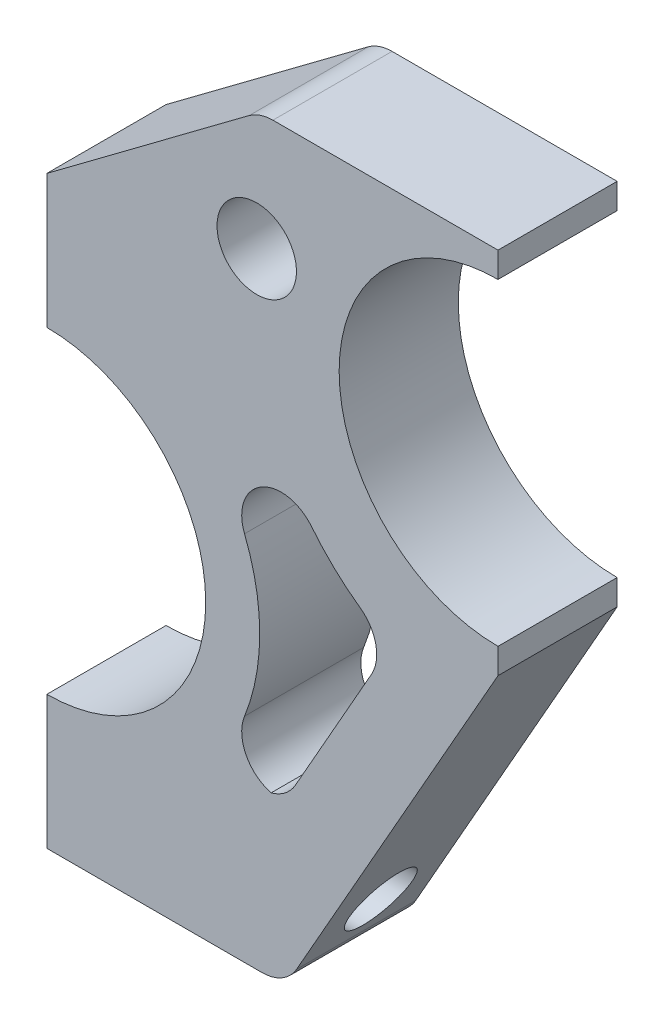
ISO-10303-21;
HEADER;
FILE_DESCRIPTION(('STEP AP214'),'2;1');
FILE_NAME('part.step','',(''),(''),'','','');
FILE_SCHEMA(('AUTOMOTIVE_DESIGN { 1 0 10303 214 1 1 1 1 }'));
ENDSEC;
DATA;
#1=APPLICATION_CONTEXT('core data for automotive mechanical design processes');
#2=APPLICATION_PROTOCOL_DEFINITION('international standard','automotive_design',2000,#1);
#3=PRODUCT_CONTEXT('',#1,'mechanical');
#4=PRODUCT('Part','Part','',(#3));
#5=PRODUCT_RELATED_PRODUCT_CATEGORY('part','',(#4));
#6=PRODUCT_DEFINITION_FORMATION('','',#4);
#7=PRODUCT_DEFINITION_CONTEXT('part definition',#1,'design');
#8=PRODUCT_DEFINITION('design','',#6,#7);
#9=PRODUCT_DEFINITION_SHAPE('','',#8);
#10=(LENGTH_UNIT() NAMED_UNIT(*) SI_UNIT(.MILLI.,.METRE.));
#11=(NAMED_UNIT(*) PLANE_ANGLE_UNIT() SI_UNIT($,.RADIAN.));
#12=(NAMED_UNIT(*) SI_UNIT($,.STERADIAN.) SOLID_ANGLE_UNIT());
#13=UNCERTAINTY_MEASURE_WITH_UNIT(LENGTH_MEASURE(1.E-05),#10,'distance_accuracy_value','');
#14=(GEOMETRIC_REPRESENTATION_CONTEXT(3) GLOBAL_UNCERTAINTY_ASSIGNED_CONTEXT((#13)) GLOBAL_UNIT_ASSIGNED_CONTEXT((#10,
#11,#12)) REPRESENTATION_CONTEXT('',''));
#15=CARTESIAN_POINT('',(0.,0.,0.));
#16=DIRECTION('',(0.,0.,1.));
#17=DIRECTION('',(1.,0.,0.));
#18=AXIS2_PLACEMENT_3D('',#15,#16,#17);
#19=CARTESIAN_POINT('',(-169.887417499531,827.319119624844,9.525));
#20=DIRECTION('',(0.,0.,1.));
#21=DIRECTION('',(1.,0.,0.));
#22=AXIS2_PLACEMENT_3D('',#19,#20,#21);
#23=PLANE('',#22);
#24=CARTESIAN_POINT('',(-169.887417499531,827.319119624844,9.525));
#25=DIRECTION('',(0.,0.,-1.));
#26=DIRECTION('',(-1.,0.,0.));
#27=AXIS2_PLACEMENT_3D('',#24,#25,#26);
#28=CIRCLE('',#27,12.7);
#29=CARTESIAN_POINT('',(-169.887417499531,840.019119624844,9.525));
#30=VERTEX_POINT('',#29);
#31=CARTESIAN_POINT('',(-169.887417499531,814.619119624844,9.525));
#32=VERTEX_POINT('',#31);
#33=EDGE_CURVE('E59',#30,#32,#28,.T.);
#34=ORIENTED_EDGE('',*,*,#33,.T.);
#35=DIRECTION('',(0.,-1.,0.));
#36=VECTOR('',#35,1.);
#37=CARTESIAN_POINT('',(-169.887417499531,816.651119624844,9.525));
#38=LINE('',#37,#36);
#39=CARTESIAN_POINT('',(-169.887417499531,803.951119624844,9.525));
#40=VERTEX_POINT('',#39);
#41=EDGE_CURVE('E202',#32,#40,#38,.T.);
#42=ORIENTED_EDGE('',*,*,#41,.T.);
#43=DIRECTION('',(1.,0.,0.));
#44=VECTOR('',#43,1.);
#45=CARTESIAN_POINT('',(-169.887417499531,803.951119624844,9.525));
#46=LINE('',#45,#44);
#47=CARTESIAN_POINT('',(-152.686373541407,803.951119624844,9.525));
#48=VERTEX_POINT('',#47);
#49=EDGE_CURVE('E207',#40,#48,#46,.T.);
#50=ORIENTED_EDGE('',*,*,#49,.T.);
#51=CARTESIAN_POINT('',(-152.686373541407,807.126119624844,9.525));
#52=DIRECTION('',(0.,0.,1.));
#53=DIRECTION('',(1.,0.,0.));
#54=AXIS2_PLACEMENT_3D('',#51,#52,#53);
#55=CIRCLE('',#54,3.175);
#56=CARTESIAN_POINT('',(-149.924943989956,805.559233594409,9.525));
#57=VERTEX_POINT('',#56);
#58=EDGE_CURVE('E264',#48,#57,#55,.T.);
#59=ORIENTED_EDGE('',*,*,#58,.T.);
#60=DIRECTION('',(0.493507411160631,0.869741591008233,0.));
#61=VECTOR('',#60,1.);
#62=CARTESIAN_POINT('',(-150.837417499531,803.951119624844,9.525));
#63=LINE('',#62,#61);
#64=CARTESIAN_POINT('',(-133.819417499531,833.943095552761,9.525));
#65=VERTEX_POINT('',#64);
#66=EDGE_CURVE('E378',#57,#65,#63,.T.);
#67=ORIENTED_EDGE('',*,*,#66,.T.);
#68=DIRECTION('',(0.,1.,0.));
#69=VECTOR('',#68,1.);
#70=CARTESIAN_POINT('',(-133.819417499531,833.943095552761,9.525));
#71=LINE('',#70,#69);
#72=CARTESIAN_POINT('',(-133.819417499531,835.975095552761,9.525));
#73=VERTEX_POINT('',#72);
#74=EDGE_CURVE('E381',#65,#73,#71,.T.);
#75=ORIENTED_EDGE('',*,*,#74,.T.);
#76=CARTESIAN_POINT('',(-133.819417499531,848.675095552761,9.525));
#77=DIRECTION('',(0.,0.,-1.));
#78=DIRECTION('',(1.,0.,0.));
#79=AXIS2_PLACEMENT_3D('',#76,#77,#78);
#80=CIRCLE('',#79,12.7);
#81=CARTESIAN_POINT('',(-133.819417499531,861.375095552761,9.525));
#82=VERTEX_POINT('',#81);
#83=EDGE_CURVE('E384',#73,#82,#80,.T.);
#84=ORIENTED_EDGE('',*,*,#83,.T.);
#85=DIRECTION('',(0.,1.,0.));
#86=VECTOR('',#85,1.);
#87=CARTESIAN_POINT('',(-133.819417499531,861.375095552761,9.525));
#88=LINE('',#87,#86);
#89=CARTESIAN_POINT('',(-133.819417499531,863.407095552761,9.525));
#90=VERTEX_POINT('',#89);
#91=EDGE_CURVE('E387',#82,#90,#88,.T.);
#92=ORIENTED_EDGE('',*,*,#91,.T.);
#93=DIRECTION('',(-1.,0.,0.));
#94=VECTOR('',#93,1.);
#95=CARTESIAN_POINT('',(-133.819417499531,863.407095552761,9.525));
#96=LINE('',#95,#94);
#97=CARTESIAN_POINT('',(-151.813974092557,863.407095552761,9.525));
#98=VERTEX_POINT('',#97);
#99=EDGE_CURVE('E390',#90,#98,#96,.T.);
#100=ORIENTED_EDGE('',*,*,#99,.T.);
#101=CARTESIAN_POINT('',(-151.813974092557,860.232095552761,9.525));
#102=DIRECTION('',(0.,0.,1.));
#103=DIRECTION('',(1.,0.,0.));
#104=AXIS2_PLACEMENT_3D('',#101,#102,#103);
#105=CIRCLE('',#104,3.175);
#106=CARTESIAN_POINT('',(-153.71480890654,862.775214112708,9.525));
#107=VERTEX_POINT('',#106);
#108=EDGE_CURVE('E267',#98,#107,#105,.T.);
#109=ORIENTED_EDGE('',*,*,#108,.T.);
#110=DIRECTION('',(-0.80098222360548,-0.598688130388453,0.));
#111=VECTOR('',#110,1.);
#112=CARTESIAN_POINT('',(-152.869417499531,863.407095552761,9.525));
#113=LINE('',#112,#111);
#114=CARTESIAN_POINT('',(-169.887417499531,850.687119624844,9.525));
#115=VERTEX_POINT('',#114);
#116=EDGE_CURVE('E394',#107,#115,#113,.T.);
#117=ORIENTED_EDGE('',*,*,#116,.T.);
#118=DIRECTION('',(0.,-1.,0.));
#119=VECTOR('',#118,1.);
#120=CARTESIAN_POINT('',(-169.887417499531,850.687119624844,9.525));
#121=LINE('',#120,#119);
#122=EDGE_CURVE('E216',#115,#30,#121,.T.);
#123=ORIENTED_EDGE('',*,*,#122,.T.);
#124=EDGE_LOOP('',(#34,#42,#50,#59,#67,#75,#84,#92,#100,#109,#117,#123));
#125=FACE_BOUND('',#124,.T.);
#126=CARTESIAN_POINT('',(-153.108454604195,853.862119624844,9.525));
#127=DIRECTION('',(0.,0.,1.));
#128=DIRECTION('',(1.,0.,0.));
#129=AXIS2_PLACEMENT_3D('',#126,#127,#128);
#130=CIRCLE('',#129,3.175);
#131=CARTESIAN_POINT('',(-156.283454604195,853.862119624844,9.525));
#132=VERTEX_POINT('',#131);
#133=EDGE_CURVE('E368',#132,#132,#130,.T.);
#134=ORIENTED_EDGE('',*,*,#133,.F.);
#135=EDGE_LOOP('',(#134));
#136=FACE_BOUND('',#135,.T.);
#137=CARTESIAN_POINT('',(-152.781178572134,819.826119624844,9.525));
#138=DIRECTION('',(0.,0.,1.));
#139=DIRECTION('',(1.,0.,0.));
#140=AXIS2_PLACEMENT_3D('',#137,#138,#139);
#141=CIRCLE('',#140,3.175);
#142=CARTESIAN_POINT('',(-150.019749020682,818.259233594409,9.525));
#143=VERTEX_POINT('',#142);
#144=CARTESIAN_POINT('',(-151.958635392584,816.759517642556,9.525));
#145=VERTEX_POINT('',#144);
#146=EDGE_CURVE('E292',#143,#145,#141,.F.);
#147=ORIENTED_EDGE('',*,*,#146,.T.);
#148=CARTESIAN_POINT('',(-151.136092213035,819.826119624844,9.525));
#149=DIRECTION('',(0.,0.,1.));
#150=DIRECTION('',(1.,0.,0.));
#151=AXIS2_PLACEMENT_3D('',#148,#149,#150);
#152=CIRCLE('',#151,3.175);
#153=CARTESIAN_POINT('',(-154.084413798962,821.004264278933,9.525));
#154=VERTEX_POINT('',#153);
#155=EDGE_CURVE('E52',#145,#154,#152,.F.);
#156=ORIENTED_EDGE('',*,*,#155,.T.);
#157=CARTESIAN_POINT('',(-169.887417499531,827.319119624844,9.525));
#158=DIRECTION('',(0.,0.,-1.));
#159=DIRECTION('',(1.,0.,0.));
#160=AXIS2_PLACEMENT_3D('',#157,#158,#159);
#161=CIRCLE('',#160,17.018);
#162=CARTESIAN_POINT('',(-154.084413798962,833.633974970756,9.525));
#163=VERTEX_POINT('',#162);
#164=EDGE_CURVE('E344',#163,#154,#161,.T.);
#165=ORIENTED_EDGE('',*,*,#164,.F.);
#166=CARTESIAN_POINT('',(-151.136092213035,834.812119624844,9.525));
#167=DIRECTION('',(0.,0.,1.));
#168=DIRECTION('',(1.,0.,0.));
#169=AXIS2_PLACEMENT_3D('',#166,#167,#168);
#170=CIRCLE('',#169,3.175);
#171=CARTESIAN_POINT('',(-151.163497821367,837.987001344315,9.525));
#172=VERTEX_POINT('',#171);
#173=EDGE_CURVE('E66',#163,#172,#170,.F.);
#174=ORIENTED_EDGE('',*,*,#173,.T.);
#175=CARTESIAN_POINT('',(-151.190903429699,834.812119624844,9.525));
#176=DIRECTION('',(0.,0.,1.));
#177=DIRECTION('',(1.,0.,0.));
#178=AXIS2_PLACEMENT_3D('',#175,#176,#177);
#179=CIRCLE('',#178,3.175);
#180=CARTESIAN_POINT('',(-148.709262582532,836.792544757404,9.525));
#181=VERTEX_POINT('',#180);
#182=EDGE_CURVE('E298',#172,#181,#179,.F.);
#183=ORIENTED_EDGE('',*,*,#182,.T.);
#184=CARTESIAN_POINT('',(-133.819417499531,848.675095552761,9.525));
#185=DIRECTION('',(0.,0.,-1.));
#186=DIRECTION('',(1.,0.,0.));
#187=AXIS2_PLACEMENT_3D('',#184,#185,#186);
#188=CIRCLE('',#187,19.05);
#189=CARTESIAN_POINT('',(-144.853056684026,833.14572639795,9.525));
#190=VERTEX_POINT('',#189);
#191=EDGE_CURVE('E353',#190,#181,#188,.T.);
#192=ORIENTED_EDGE('',*,*,#191,.F.);
#193=CARTESIAN_POINT('',(-146.691996548108,830.557498205482,9.525));
#194=DIRECTION('',(0.,0.,1.));
#195=DIRECTION('',(1.,0.,0.));
#196=AXIS2_PLACEMENT_3D('',#193,#194,#195);
#197=CIRCLE('',#196,3.175);
#198=CARTESIAN_POINT('',(-143.930566996657,828.990612175047,9.525));
#199=VERTEX_POINT('',#198);
#200=EDGE_CURVE('E286',#190,#199,#197,.F.);
#201=ORIENTED_EDGE('',*,*,#200,.T.);
#202=DIRECTION('',(0.493507411160631,0.869741591008233,0.));
#203=VECTOR('',#202,1.);
#204=CARTESIAN_POINT('',(-150.932222530258,816.651119624844,9.525));
#205=LINE('',#204,#203);
#206=EDGE_CURVE('E348',#143,#199,#205,.T.);
#207=ORIENTED_EDGE('',*,*,#206,.F.);
#208=EDGE_LOOP('',(#147,#156,#165,#174,#183,#192,#201,#207));
#209=FACE_BOUND('',#208,.T.);
#210=ADVANCED_FACE('F43',(#125,#136,#209),#23,.T.);
#211=CARTESIAN_POINT('',(-169.887417499531,827.319119624844,0.));
#212=DIRECTION('',(0.,0.,1.));
#213=DIRECTION('',(1.,0.,0.));
#214=AXIS2_PLACEMENT_3D('',#211,#212,#213);
#215=PLANE('',#214);
#216=CARTESIAN_POINT('',(-153.108454604195,853.862119624844,0.));
#217=DIRECTION('',(0.,0.,1.));
#218=DIRECTION('',(1.,0.,0.));
#219=AXIS2_PLACEMENT_3D('',#216,#217,#218);
#220=CIRCLE('',#219,3.175);
#221=CARTESIAN_POINT('',(-156.283454604195,853.862119624844,0.));
#222=VERTEX_POINT('',#221);
#223=EDGE_CURVE('E357',#222,#222,#220,.T.);
#224=ORIENTED_EDGE('',*,*,#223,.T.);
#225=EDGE_LOOP('',(#224));
#226=FACE_BOUND('',#225,.T.);
#227=DIRECTION('',(0.,-1.,0.));
#228=VECTOR('',#227,1.);
#229=CARTESIAN_POINT('',(-169.887417499531,816.651119624844,0.));
#230=LINE('',#229,#228);
#231=CARTESIAN_POINT('',(-169.887417499531,814.619119624844,0.));
#232=VERTEX_POINT('',#231);
#233=CARTESIAN_POINT('',(-169.887417499531,803.951119624844,0.));
#234=VERTEX_POINT('',#233);
#235=EDGE_CURVE('E194',#232,#234,#230,.T.);
#236=ORIENTED_EDGE('',*,*,#235,.F.);
#237=CARTESIAN_POINT('',(-169.887417499531,827.319119624844,0.));
#238=DIRECTION('',(0.,0.,-1.));
#239=DIRECTION('',(-1.,0.,0.));
#240=AXIS2_PLACEMENT_3D('',#237,#238,#239);
#241=CIRCLE('',#240,12.7);
#242=CARTESIAN_POINT('',(-169.887417499531,840.019119624844,0.));
#243=VERTEX_POINT('',#242);
#244=EDGE_CURVE('E180',#243,#232,#241,.T.);
#245=ORIENTED_EDGE('',*,*,#244,.F.);
#246=DIRECTION('',(0.,-1.,0.));
#247=VECTOR('',#246,1.);
#248=CARTESIAN_POINT('',(-169.887417499531,850.687119624844,0.));
#249=LINE('',#248,#247);
#250=CARTESIAN_POINT('',(-169.887417499531,850.687119624844,0.));
#251=VERTEX_POINT('',#250);
#252=EDGE_CURVE('E192',#251,#243,#249,.T.);
#253=ORIENTED_EDGE('',*,*,#252,.F.);
#254=DIRECTION('',(-0.80098222360548,-0.598688130388453,0.));
#255=VECTOR('',#254,1.);
#256=CARTESIAN_POINT('',(-152.869417499531,863.407095552761,0.));
#257=LINE('',#256,#255);
#258=CARTESIAN_POINT('',(-153.71480890654,862.775214112708,0.));
#259=VERTEX_POINT('',#258);
#260=EDGE_CURVE('E203',#259,#251,#257,.T.);
#261=ORIENTED_EDGE('',*,*,#260,.F.);
#262=CARTESIAN_POINT('',(-151.813974092557,860.232095552761,0.));
#263=DIRECTION('',(0.,0.,1.));
#264=DIRECTION('',(1.,0.,0.));
#265=AXIS2_PLACEMENT_3D('',#262,#263,#264);
#266=CIRCLE('',#265,3.175);
#267=CARTESIAN_POINT('',(-151.813974092557,863.407095552761,0.));
#268=VERTEX_POINT('',#267);
#269=EDGE_CURVE('E258',#259,#268,#266,.F.);
#270=ORIENTED_EDGE('',*,*,#269,.T.);
#271=DIRECTION('',(-1.,0.,0.));
#272=VECTOR('',#271,1.);
#273=CARTESIAN_POINT('',(-133.819417499531,863.407095552761,0.));
#274=LINE('',#273,#272);
#275=CARTESIAN_POINT('',(-133.819417499531,863.407095552761,0.));
#276=VERTEX_POINT('',#275);
#277=EDGE_CURVE('E209',#276,#268,#274,.T.);
#278=ORIENTED_EDGE('',*,*,#277,.F.);
#279=DIRECTION('',(0.,1.,0.));
#280=VECTOR('',#279,1.);
#281=CARTESIAN_POINT('',(-133.819417499531,861.375095552761,0.));
#282=LINE('',#281,#280);
#283=CARTESIAN_POINT('',(-133.819417499531,861.375095552761,0.));
#284=VERTEX_POINT('',#283);
#285=EDGE_CURVE('E414',#284,#276,#282,.T.);
#286=ORIENTED_EDGE('',*,*,#285,.F.);
#287=CARTESIAN_POINT('',(-133.819417499531,848.675095552761,0.));
#288=DIRECTION('',(0.,0.,-1.));
#289=DIRECTION('',(1.,0.,0.));
#290=AXIS2_PLACEMENT_3D('',#287,#288,#289);
#291=CIRCLE('',#290,12.7);
#292=CARTESIAN_POINT('',(-133.819417499531,835.975095552761,0.));
#293=VERTEX_POINT('',#292);
#294=EDGE_CURVE('E411',#293,#284,#291,.T.);
#295=ORIENTED_EDGE('',*,*,#294,.F.);
#296=DIRECTION('',(0.,1.,0.));
#297=VECTOR('',#296,1.);
#298=CARTESIAN_POINT('',(-133.819417499531,833.943095552761,0.));
#299=LINE('',#298,#297);
#300=CARTESIAN_POINT('',(-133.819417499531,833.943095552761,0.));
#301=VERTEX_POINT('',#300);
#302=EDGE_CURVE('E408',#301,#293,#299,.T.);
#303=ORIENTED_EDGE('',*,*,#302,.F.);
#304=DIRECTION('',(0.493507411160631,0.869741591008233,0.));
#305=VECTOR('',#304,1.);
#306=CARTESIAN_POINT('',(-150.837417499531,803.951119624844,0.));
#307=LINE('',#306,#305);
#308=CARTESIAN_POINT('',(-149.924943989956,805.559233594409,0.));
#309=VERTEX_POINT('',#308);
#310=EDGE_CURVE('E405',#309,#301,#307,.T.);
#311=ORIENTED_EDGE('',*,*,#310,.F.);
#312=CARTESIAN_POINT('',(-152.686373541407,807.126119624844,0.));
#313=DIRECTION('',(0.,0.,1.));
#314=DIRECTION('',(1.,0.,0.));
#315=AXIS2_PLACEMENT_3D('',#312,#313,#314);
#316=CIRCLE('',#315,3.175);
#317=CARTESIAN_POINT('',(-152.686373541407,803.951119624844,0.));
#318=VERTEX_POINT('',#317);
#319=EDGE_CURVE('E255',#309,#318,#316,.F.);
#320=ORIENTED_EDGE('',*,*,#319,.T.);
#321=DIRECTION('',(1.,0.,0.));
#322=VECTOR('',#321,1.);
#323=CARTESIAN_POINT('',(-169.887417499531,803.951119624844,0.));
#324=LINE('',#323,#322);
#325=EDGE_CURVE('E401',#234,#318,#324,.T.);
#326=ORIENTED_EDGE('',*,*,#325,.F.);
#327=EDGE_LOOP('',(#236,#245,#253,#261,#270,#278,#286,#295,#303,#311,#320,#326));
#328=FACE_BOUND('',#327,.T.);
#329=CARTESIAN_POINT('',(-151.190903429699,834.812119624844,0.));
#330=DIRECTION('',(0.,0.,1.));
#331=DIRECTION('',(1.,0.,0.));
#332=AXIS2_PLACEMENT_3D('',#329,#330,#331);
#333=CIRCLE('',#332,3.175);
#334=CARTESIAN_POINT('',(-148.709262582532,836.792544757404,0.));
#335=VERTEX_POINT('',#334);
#336=CARTESIAN_POINT('',(-151.163497821367,837.987001344315,0.));
#337=VERTEX_POINT('',#336);
#338=EDGE_CURVE('E295',#335,#337,#333,.T.);
#339=ORIENTED_EDGE('',*,*,#338,.T.);
#340=CARTESIAN_POINT('',(-151.136092213035,834.812119624844,0.));
#341=DIRECTION('',(0.,0.,1.));
#342=DIRECTION('',(1.,0.,0.));
#343=AXIS2_PLACEMENT_3D('',#340,#341,#342);
#344=CIRCLE('',#343,3.175);
#345=CARTESIAN_POINT('',(-154.084413798962,833.633974970756,0.));
#346=VERTEX_POINT('',#345);
#347=EDGE_CURVE('E301',#337,#346,#344,.T.);
#348=ORIENTED_EDGE('',*,*,#347,.T.);
#349=CARTESIAN_POINT('',(-169.887417499531,827.319119624844,0.));
#350=DIRECTION('',(0.,0.,-1.));
#351=DIRECTION('',(1.,0.,0.));
#352=AXIS2_PLACEMENT_3D('',#349,#350,#351);
#353=CIRCLE('',#352,17.018);
#354=CARTESIAN_POINT('',(-154.084413798962,821.004264278933,0.));
#355=VERTEX_POINT('',#354);
#356=EDGE_CURVE('E336',#346,#355,#353,.T.);
#357=ORIENTED_EDGE('',*,*,#356,.T.);
#358=CARTESIAN_POINT('',(-151.136092213035,819.826119624844,0.));
#359=DIRECTION('',(0.,0.,1.));
#360=DIRECTION('',(1.,0.,0.));
#361=AXIS2_PLACEMENT_3D('',#358,#359,#360);
#362=CIRCLE('',#361,3.175);
#363=CARTESIAN_POINT('',(-151.958635392584,816.759517642556,0.));
#364=VERTEX_POINT('',#363);
#365=EDGE_CURVE('E306',#355,#364,#362,.T.);
#366=ORIENTED_EDGE('',*,*,#365,.T.);
#367=CARTESIAN_POINT('',(-152.781178572134,819.826119624844,0.));
#368=DIRECTION('',(0.,0.,1.));
#369=DIRECTION('',(1.,0.,0.));
#370=AXIS2_PLACEMENT_3D('',#367,#368,#369);
#371=CIRCLE('',#370,3.175);
#372=CARTESIAN_POINT('',(-150.019749020682,818.259233594409,0.));
#373=VERTEX_POINT('',#372);
#374=EDGE_CURVE('E289',#364,#373,#371,.T.);
#375=ORIENTED_EDGE('',*,*,#374,.T.);
#376=DIRECTION('',(0.493507411160631,0.869741591008233,0.));
#377=VECTOR('',#376,1.);
#378=CARTESIAN_POINT('',(-150.932222530258,816.651119624844,0.));
#379=LINE('',#378,#377);
#380=CARTESIAN_POINT('',(-143.930566996657,828.990612175047,0.));
#381=VERTEX_POINT('',#380);
#382=EDGE_CURVE('E361',#373,#381,#379,.T.);
#383=ORIENTED_EDGE('',*,*,#382,.T.);
#384=CARTESIAN_POINT('',(-146.691996548108,830.557498205482,0.));
#385=DIRECTION('',(0.,0.,1.));
#386=DIRECTION('',(1.,0.,0.));
#387=AXIS2_PLACEMENT_3D('',#384,#385,#386);
#388=CIRCLE('',#387,3.175);
#389=CARTESIAN_POINT('',(-144.853056684026,833.14572639795,0.));
#390=VERTEX_POINT('',#389);
#391=EDGE_CURVE('E283',#381,#390,#388,.T.);
#392=ORIENTED_EDGE('',*,*,#391,.T.);
#393=CARTESIAN_POINT('',(-133.819417499531,848.675095552761,0.));
#394=DIRECTION('',(0.,0.,-1.));
#395=DIRECTION('',(1.,0.,0.));
#396=AXIS2_PLACEMENT_3D('',#393,#394,#395);
#397=CIRCLE('',#396,19.05);
#398=EDGE_CURVE('E349',#390,#335,#397,.T.);
#399=ORIENTED_EDGE('',*,*,#398,.T.);
#400=EDGE_LOOP('',(#339,#348,#357,#366,#375,#383,#392,#399));
#401=FACE_BOUND('',#400,.T.);
#402=ADVANCED_FACE('F189',(#226,#328,#401),#215,.F.);
#403=CARTESIAN_POINT('',(-169.887417499531,816.651119624844,9.525));
#404=DIRECTION('',(1.,0.,0.));
#405=DIRECTION('',(0.,0.,-1.));
#406=AXIS2_PLACEMENT_3D('',#403,#404,#405);
#407=PLANE('',#406);
#408=CARTESIAN_POINT('',(-169.887417499531,809.031119624844,4.76250000000001));
#409=DIRECTION('',(-1.,0.,0.));
#410=DIRECTION('',(0.,0.,1.));
#411=AXIS2_PLACEMENT_3D('',#408,#409,#410);
#412=CIRCLE('',#411,2.53999999999997);
#413=CARTESIAN_POINT('',(-169.887417499531,809.031119624844,7.30249999999998));
#414=VERTEX_POINT('',#413);
#415=EDGE_CURVE('E331',#414,#414,#412,.T.);
#416=ORIENTED_EDGE('',*,*,#415,.F.);
#417=EDGE_LOOP('',(#416));
#418=FACE_BOUND('',#417,.T.);
#419=ORIENTED_EDGE('',*,*,#41,.F.);
#420=DIRECTION('',(0.,0.,-1.));
#421=VECTOR('',#420,1.);
#422=CARTESIAN_POINT('',(-169.887417499531,814.619119624844,9.525));
#423=LINE('',#422,#421);
#424=EDGE_CURVE('E318',#32,#232,#423,.T.);
#425=ORIENTED_EDGE('',*,*,#424,.T.);
#426=ORIENTED_EDGE('',*,*,#235,.T.);
#427=DIRECTION('',(0.,0.,-1.));
#428=VECTOR('',#427,1.);
#429=CARTESIAN_POINT('',(-169.887417499531,803.951119624844,9.525));
#430=LINE('',#429,#428);
#431=EDGE_CURVE('E232',#40,#234,#430,.T.);
#432=ORIENTED_EDGE('',*,*,#431,.F.);
#433=EDGE_LOOP('',(#419,#425,#426,#432));
#434=FACE_BOUND('',#433,.T.);
#435=ADVANCED_FACE('F435',(#418,#434),#407,.F.);
#436=CARTESIAN_POINT('',(-169.887417499531,803.951119624844,9.525));
#437=DIRECTION('',(0.,1.,0.));
#438=DIRECTION('',(0.,0.,1.));
#439=AXIS2_PLACEMENT_3D('',#436,#437,#438);
#440=PLANE('',#439);
#441=ORIENTED_EDGE('',*,*,#325,.T.);
#442=DIRECTION('',(0.,0.,-1.));
#443=VECTOR('',#442,1.);
#444=CARTESIAN_POINT('',(-152.686373541407,803.951119624844,9.525));
#445=LINE('',#444,#443);
#446=EDGE_CURVE('E274',#318,#48,#445,.F.);
#447=ORIENTED_EDGE('',*,*,#446,.T.);
#448=ORIENTED_EDGE('',*,*,#49,.F.);
#449=ORIENTED_EDGE('',*,*,#431,.T.);
#450=EDGE_LOOP('',(#441,#447,#448,#449));
#451=FACE_BOUND('',#450,.T.);
#452=ADVANCED_FACE('F438',(#451),#440,.F.);
#453=CARTESIAN_POINT('',(-150.837417499531,803.951119624844,9.525));
#454=DIRECTION('',(-0.869741591008233,0.493507411160631,0.));
#455=DIRECTION('',(-0.493507411160631,-0.869741591008233,0.));
#456=AXIS2_PLACEMENT_3D('',#453,#454,#455);
#457=PLANE('',#456);
#458=CARTESIAN_POINT('',(-147.954931857112,809.031119624844,4.76250000000001));
#459=DIRECTION('',(-0.869741591008233,0.493507411160631,0.));
#460=DIRECTION('',(-0.493507411160631,-0.869741591008233,0.));
#461=AXIS2_PLACEMENT_3D('',#458,#459,#460);
#462=ELLIPSE('',#461,2.92040765470984,2.53999999999996);
#463=CARTESIAN_POINT('',(-149.396174678322,806.491119624844,4.76250000000001));
#464=VERTEX_POINT('',#463);
#465=EDGE_CURVE('E314',#464,#464,#462,.F.);
#466=ORIENTED_EDGE('',*,*,#465,.F.);
#467=EDGE_LOOP('',(#466));
#468=FACE_BOUND('',#467,.T.);
#469=ORIENTED_EDGE('',*,*,#66,.F.);
#470=DIRECTION('',(0.,0.,-1.));
#471=VECTOR('',#470,1.);
#472=CARTESIAN_POINT('',(-149.924943989956,805.559233594409,9.525));
#473=LINE('',#472,#471);
#474=EDGE_CURVE('E270',#57,#309,#473,.T.);
#475=ORIENTED_EDGE('',*,*,#474,.T.);
#476=ORIENTED_EDGE('',*,*,#310,.T.);
#477=DIRECTION('',(0.,0.,-1.));
#478=VECTOR('',#477,1.);
#479=CARTESIAN_POINT('',(-133.819417499531,833.943095552761,9.525));
#480=LINE('',#479,#478);
#481=EDGE_CURVE('E228',#65,#301,#480,.T.);
#482=ORIENTED_EDGE('',*,*,#481,.F.);
#483=EDGE_LOOP('',(#469,#475,#476,#482));
#484=FACE_BOUND('',#483,.T.);
#485=ADVANCED_FACE('F447',(#468,#484),#457,.F.);
#486=CARTESIAN_POINT('',(-133.819417499531,833.943095552761,9.525));
#487=DIRECTION('',(-1.,0.,0.));
#488=DIRECTION('',(0.,0.,1.));
#489=AXIS2_PLACEMENT_3D('',#486,#487,#488);
#490=PLANE('',#489);
#491=ORIENTED_EDGE('',*,*,#302,.T.);
#492=DIRECTION('',(0.,0.,-1.));
#493=VECTOR('',#492,1.);
#494=CARTESIAN_POINT('',(-133.819417499531,835.975095552761,9.525));
#495=LINE('',#494,#493);
#496=EDGE_CURVE('E224',#73,#293,#495,.T.);
#497=ORIENTED_EDGE('',*,*,#496,.F.);
#498=ORIENTED_EDGE('',*,*,#74,.F.);
#499=ORIENTED_EDGE('',*,*,#481,.T.);
#500=EDGE_LOOP('',(#491,#497,#498,#499));
#501=FACE_BOUND('',#500,.T.);
#502=ADVANCED_FACE('F453',(#501),#490,.F.);
#503=CARTESIAN_POINT('',(-133.819417499531,848.675095552761,9.525));
#504=DIRECTION('',(0.,0.,-1.));
#505=DIRECTION('',(-1.,0.,0.));
#506=AXIS2_PLACEMENT_3D('',#503,#504,#505);
#507=CYLINDRICAL_SURFACE('',#506,12.7);
#508=ORIENTED_EDGE('',*,*,#294,.T.);
#509=DIRECTION('',(0.,0.,-1.));
#510=VECTOR('',#509,1.);
#511=CARTESIAN_POINT('',(-133.819417499531,861.375095552761,9.525));
#512=LINE('',#511,#510);
#513=EDGE_CURVE('E220',#82,#284,#512,.T.);
#514=ORIENTED_EDGE('',*,*,#513,.F.);
#515=ORIENTED_EDGE('',*,*,#83,.F.);
#516=ORIENTED_EDGE('',*,*,#496,.T.);
#517=EDGE_LOOP('',(#508,#514,#515,#516));
#518=FACE_BOUND('',#517,.T.);
#519=ADVANCED_FACE('F457',(#518),#507,.F.);
#520=CARTESIAN_POINT('',(-133.819417499531,861.375095552761,9.525));
#521=DIRECTION('',(-1.,0.,0.));
#522=DIRECTION('',(0.,-1.,0.));
#523=AXIS2_PLACEMENT_3D('',#520,#521,#522);
#524=PLANE('',#523);
#525=ORIENTED_EDGE('',*,*,#285,.T.);
#526=DIRECTION('',(0.,0.,-1.));
#527=VECTOR('',#526,1.);
#528=CARTESIAN_POINT('',(-133.819417499531,863.407095552761,9.525));
#529=LINE('',#528,#527);
#530=EDGE_CURVE('E215',#90,#276,#529,.T.);
#531=ORIENTED_EDGE('',*,*,#530,.F.);
#532=ORIENTED_EDGE('',*,*,#91,.F.);
#533=ORIENTED_EDGE('',*,*,#513,.T.);
#534=EDGE_LOOP('',(#525,#531,#532,#533));
#535=FACE_BOUND('',#534,.T.);
#536=ADVANCED_FACE('F461',(#535),#524,.F.);
#537=CARTESIAN_POINT('',(-133.819417499531,863.407095552761,9.525));
#538=DIRECTION('',(0.,-1.,0.));
#539=DIRECTION('',(1.,0.,0.));
#540=AXIS2_PLACEMENT_3D('',#537,#538,#539);
#541=PLANE('',#540);
#542=ORIENTED_EDGE('',*,*,#277,.T.);
#543=DIRECTION('',(0.,0.,-1.));
#544=VECTOR('',#543,1.);
#545=CARTESIAN_POINT('',(-151.813974092557,863.407095552761,9.525));
#546=LINE('',#545,#544);
#547=EDGE_CURVE('E261',#268,#98,#546,.F.);
#548=ORIENTED_EDGE('',*,*,#547,.T.);
#549=ORIENTED_EDGE('',*,*,#99,.F.);
#550=ORIENTED_EDGE('',*,*,#530,.T.);
#551=EDGE_LOOP('',(#542,#548,#549,#550));
#552=FACE_BOUND('',#551,.T.);
#553=ADVANCED_FACE('F421',(#552),#541,.F.);
#554=CARTESIAN_POINT('',(-152.869417499531,863.407095552761,9.525));
#555=DIRECTION('',(0.598688130388453,-0.80098222360548,0.));
#556=DIRECTION('',(0.80098222360548,0.598688130388453,0.));
#557=AXIS2_PLACEMENT_3D('',#554,#555,#556);
#558=PLANE('',#557);
#559=ORIENTED_EDGE('',*,*,#116,.F.);
#560=DIRECTION('',(0.,0.,-1.));
#561=VECTOR('',#560,1.);
#562=CARTESIAN_POINT('',(-153.71480890654,862.775214112708,9.525));
#563=LINE('',#562,#561);
#564=EDGE_CURVE('E251',#107,#259,#563,.T.);
#565=ORIENTED_EDGE('',*,*,#564,.T.);
#566=ORIENTED_EDGE('',*,*,#260,.T.);
#567=DIRECTION('',(0.,0.,-1.));
#568=VECTOR('',#567,1.);
#569=CARTESIAN_POINT('',(-169.887417499531,850.687119624844,9.525));
#570=LINE('',#569,#568);
#571=EDGE_CURVE('E200',#115,#251,#570,.T.);
#572=ORIENTED_EDGE('',*,*,#571,.F.);
#573=EDGE_LOOP('',(#559,#565,#566,#572));
#574=FACE_BOUND('',#573,.T.);
#575=ADVANCED_FACE('F433',(#574),#558,.F.);
#576=CARTESIAN_POINT('',(-169.887417499531,850.687119624844,9.525));
#577=DIRECTION('',(1.,0.,0.));
#578=DIRECTION('',(0.,0.,-1.));
#579=AXIS2_PLACEMENT_3D('',#576,#577,#578);
#580=PLANE('',#579);
#581=CARTESIAN_POINT('',(-169.887417499531,845.607119624844,4.7625));
#582=DIRECTION('',(-1.,0.,0.));
#583=DIRECTION('',(0.,0.,1.));
#584=AXIS2_PLACEMENT_3D('',#581,#582,#583);
#585=CIRCLE('',#584,2.53999999999997);
#586=CARTESIAN_POINT('',(-169.887417499531,845.607119624844,7.30249999999997));
#587=VERTEX_POINT('',#586);
#588=EDGE_CURVE('E337',#587,#587,#585,.T.);
#589=ORIENTED_EDGE('',*,*,#588,.F.);
#590=EDGE_LOOP('',(#589));
#591=FACE_BOUND('',#590,.T.);
#592=ORIENTED_EDGE('',*,*,#252,.T.);
#593=DIRECTION('',(0.,0.,-1.));
#594=VECTOR('',#593,1.);
#595=CARTESIAN_POINT('',(-169.887417499531,840.019119624844,9.525));
#596=LINE('',#595,#594);
#597=EDGE_CURVE('E11',#243,#30,#596,.F.);
#598=ORIENTED_EDGE('',*,*,#597,.T.);
#599=ORIENTED_EDGE('',*,*,#122,.F.);
#600=ORIENTED_EDGE('',*,*,#571,.T.);
#601=EDGE_LOOP('',(#592,#598,#599,#600));
#602=FACE_BOUND('',#601,.T.);
#603=ADVANCED_FACE('F198',(#591,#602),#580,.F.);
#604=CARTESIAN_POINT('',(-153.108454604195,853.862119624844,9.525));
#605=DIRECTION('',(0.,0.,-1.));
#606=DIRECTION('',(-1.,0.,0.));
#607=AXIS2_PLACEMENT_3D('',#604,#605,#606);
#608=CYLINDRICAL_SURFACE('',#607,3.175);
#609=CARTESIAN_POINT('',(-156.283454604195,853.862119624844,9.525));
#610=CARTESIAN_POINT('',(-156.283454604195,853.862119624844,9.42578125));
#611=CARTESIAN_POINT('',(-156.283454604195,853.862119624844,9.3265625));
#612=CARTESIAN_POINT('',(-156.283454604195,853.862119624844,9.128125));
#613=CARTESIAN_POINT('',(-156.283454604195,853.862119624844,9.02890625));
#614=CARTESIAN_POINT('',(-156.283454604195,853.862119624844,8.83046875));
#615=CARTESIAN_POINT('',(-156.283454604195,853.862119624844,8.73125));
#616=CARTESIAN_POINT('',(-156.283454604195,853.862119624844,8.5328125));
#617=CARTESIAN_POINT('',(-156.283454604195,853.862119624844,8.43359375));
#618=CARTESIAN_POINT('',(-156.283454604195,853.862119624844,8.23515625));
#619=CARTESIAN_POINT('',(-156.283454604195,853.862119624844,8.1359375));
#620=CARTESIAN_POINT('',(-156.283454604195,853.862119624844,7.9375));
#621=CARTESIAN_POINT('',(-156.283454604195,853.862119624844,7.83828125));
#622=CARTESIAN_POINT('',(-156.283454604195,853.862119624844,7.63984375));
#623=CARTESIAN_POINT('',(-156.283454604195,853.862119624844,7.540625));
#624=CARTESIAN_POINT('',(-156.283454604195,853.862119624844,7.3421875));
#625=CARTESIAN_POINT('',(-156.283454604195,853.862119624844,7.24296875));
#626=CARTESIAN_POINT('',(-156.283454604195,853.862119624844,7.04453125));
#627=CARTESIAN_POINT('',(-156.283454604195,853.862119624844,6.9453125));
#628=CARTESIAN_POINT('',(-156.283454604195,853.862119624844,6.746875));
#629=CARTESIAN_POINT('',(-156.283454604195,853.862119624844,6.64765625));
#630=CARTESIAN_POINT('',(-156.283454604195,853.862119624844,6.44921875));
#631=CARTESIAN_POINT('',(-156.283454604195,853.862119624844,6.35));
#632=CARTESIAN_POINT('',(-156.283454604195,853.862119624844,6.1515625));
#633=CARTESIAN_POINT('',(-156.283454604195,853.862119624844,6.05234375));
#634=CARTESIAN_POINT('',(-156.283454604195,853.862119624844,5.85390625));
#635=CARTESIAN_POINT('',(-156.283454604195,853.862119624844,5.7546875));
#636=CARTESIAN_POINT('',(-156.283454604195,853.862119624844,5.55625));
#637=CARTESIAN_POINT('',(-156.283454604195,853.862119624844,5.45703125));
#638=CARTESIAN_POINT('',(-156.283454604195,853.862119624844,5.25859375));
#639=CARTESIAN_POINT('',(-156.283454604195,853.862119624844,5.159375));
#640=CARTESIAN_POINT('',(-156.283454604195,853.862119624844,4.9609375));
#641=CARTESIAN_POINT('',(-156.283454604195,853.862119624844,4.86171875));
#642=CARTESIAN_POINT('',(-156.283454604195,853.862119624844,4.66328125));
#643=CARTESIAN_POINT('',(-156.283454604195,853.862119624844,4.5640625));
#644=CARTESIAN_POINT('',(-156.283454604195,853.862119624844,4.365625));
#645=CARTESIAN_POINT('',(-156.283454604195,853.862119624844,4.26640625));
#646=CARTESIAN_POINT('',(-156.283454604195,853.862119624844,4.06796875));
#647=CARTESIAN_POINT('',(-156.283454604195,853.862119624844,3.96875));
#648=CARTESIAN_POINT('',(-156.283454604195,853.862119624844,3.7703125));
#649=CARTESIAN_POINT('',(-156.283454604195,853.862119624844,3.67109375));
#650=CARTESIAN_POINT('',(-156.283454604195,853.862119624844,3.47265625));
#651=CARTESIAN_POINT('',(-156.283454604195,853.862119624844,3.3734375));
#652=CARTESIAN_POINT('',(-156.283454604195,853.862119624844,3.175));
#653=CARTESIAN_POINT('',(-156.283454604195,853.862119624844,3.07578125));
#654=CARTESIAN_POINT('',(-156.283454604195,853.862119624844,2.87734375));
#655=CARTESIAN_POINT('',(-156.283454604195,853.862119624844,2.778125));
#656=CARTESIAN_POINT('',(-156.283454604195,853.862119624844,2.5796875));
#657=CARTESIAN_POINT('',(-156.283454604195,853.862119624844,2.48046875));
#658=CARTESIAN_POINT('',(-156.283454604195,853.862119624844,2.28203125));
#659=CARTESIAN_POINT('',(-156.283454604195,853.862119624844,2.1828125));
#660=CARTESIAN_POINT('',(-156.283454604195,853.862119624844,1.984375));
#661=CARTESIAN_POINT('',(-156.283454604195,853.862119624844,1.88515625));
#662=CARTESIAN_POINT('',(-156.283454604195,853.862119624844,1.68671875));
#663=CARTESIAN_POINT('',(-156.283454604195,853.862119624844,1.5875));
#664=CARTESIAN_POINT('',(-156.283454604195,853.862119624844,1.3890625));
#665=CARTESIAN_POINT('',(-156.283454604195,853.862119624844,1.28984375));
#666=CARTESIAN_POINT('',(-156.283454604195,853.862119624844,1.09140625));
#667=CARTESIAN_POINT('',(-156.283454604195,853.862119624844,0.992187500000001));
#668=CARTESIAN_POINT('',(-156.283454604195,853.862119624844,0.793750000000001));
#669=CARTESIAN_POINT('',(-156.283454604195,853.862119624844,0.69453125));
#670=CARTESIAN_POINT('',(-156.283454604195,853.862119624844,0.49609375));
#671=CARTESIAN_POINT('',(-156.283454604195,853.862119624844,0.396875));
#672=CARTESIAN_POINT('',(-156.283454604195,853.862119624844,0.1984375));
#673=CARTESIAN_POINT('',(-156.283454604195,853.862119624844,0.0992187500000001));
#674=CARTESIAN_POINT('',(-156.283454604195,853.862119624844,0.));
#675=B_SPLINE_CURVE_WITH_KNOTS('',3,(#609,#610,#611,#612,#613,#614,#615,#616,#617,#618,#619,
#620,#621,#622,#623,#624,#625,#626,#627,#628,#629,#630,#631,#632,#633,#634,#635,#636,#637,#638,
#639,#640,#641,#642,#643,#644,#645,#646,#647,#648,#649,#650,#651,#652,#653,#654,#655,#656,#657,
#658,#659,#660,#661,#662,#663,#664,#665,#666,#667,#668,#669,#670,#671,#672,#673,#674),
.UNSPECIFIED.,.F.,.F.,(4,2,2,2,2,2,2,2,2,2,2,2,2,2,2,2,2,2,2,2,2,2,2,2,2,2,2,2,2,2,2,2,4),(0.,
0.29765625,0.5953125,0.892968750000001,1.190625,1.48828125,1.7859375,2.08359375,2.38125,
2.67890625,2.9765625,3.27421875,3.571875,3.86953125,4.1671875,4.46484375,4.7625,5.06015625,
5.3578125,5.65546875,5.953125,6.25078125,6.5484375,6.84609375,7.14375,7.44140625,7.7390625,
8.03671875,8.334375,8.63203125,8.9296875,9.22734375,9.525),.UNSPECIFIED.);
#676=EDGE_CURVE('BSEAM480',#132,#222,#675,.T.);
#677=ORIENTED_EDGE('',*,*,#133,.T.);
#678=ORIENTED_EDGE('',*,*,#223,.F.);
#679=ORIENTED_EDGE('',*,*,#676,.T.);
#680=ORIENTED_EDGE('',*,*,#676,.F.);
#681=EDGE_LOOP('',(#677,#679,#678,#680));
#682=FACE_BOUND('',#681,.T.);
#683=ADVANCED_FACE('F480',(#682),#608,.F.);
#684=CARTESIAN_POINT('',(-169.887417499531,827.319119624844,9.525));
#685=DIRECTION('',(0.,0.,-1.));
#686=DIRECTION('',(-1.,0.,0.));
#687=AXIS2_PLACEMENT_3D('',#684,#685,#686);
#688=CYLINDRICAL_SURFACE('',#687,17.018);
#689=ORIENTED_EDGE('',*,*,#356,.F.);
#690=DIRECTION('',(0.,0.,-1.));
#691=VECTOR('',#690,1.);
#692=CARTESIAN_POINT('',(-154.084413798962,833.633974970756,9.525));
#693=LINE('',#692,#691);
#694=EDGE_CURVE('E280',#346,#163,#693,.F.);
#695=ORIENTED_EDGE('',*,*,#694,.T.);
#696=ORIENTED_EDGE('',*,*,#164,.T.);
#697=DIRECTION('',(0.,0.,-1.));
#698=VECTOR('',#697,1.);
#699=CARTESIAN_POINT('',(-154.084413798962,821.004264278933,9.525));
#700=LINE('',#699,#698);
#701=EDGE_CURVE('E277',#154,#355,#700,.T.);
#702=ORIENTED_EDGE('',*,*,#701,.T.);
#703=EDGE_LOOP('',(#689,#695,#696,#702));
#704=FACE_BOUND('',#703,.T.);
#705=ADVANCED_FACE('F496',(#704),#688,.T.);
#706=CARTESIAN_POINT('',(-150.932222530258,816.651119624844,9.525));
#707=DIRECTION('',(-0.869741591008233,0.493507411160631,0.));
#708=DIRECTION('',(-0.493507411160631,-0.869741591008233,0.));
#709=AXIS2_PLACEMENT_3D('',#706,#707,#708);
#710=PLANE('',#709);
#711=ORIENTED_EDGE('',*,*,#206,.T.);
#712=DIRECTION('',(0.,0.,1.));
#713=VECTOR('',#712,1.);
#714=CARTESIAN_POINT('',(-143.930566996657,828.990612175047,0.));
#715=LINE('',#714,#713);
#716=EDGE_CURVE('E240',#199,#381,#715,.F.);
#717=ORIENTED_EDGE('',*,*,#716,.T.);
#718=ORIENTED_EDGE('',*,*,#382,.F.);
#719=DIRECTION('',(0.,0.,-1.));
#720=VECTOR('',#719,1.);
#721=CARTESIAN_POINT('',(-150.019749020682,818.259233594409,9.525));
#722=LINE('',#721,#720);
#723=EDGE_CURVE('E236',#373,#143,#722,.F.);
#724=ORIENTED_EDGE('',*,*,#723,.T.);
#725=EDGE_LOOP('',(#711,#717,#718,#724));
#726=FACE_BOUND('',#725,.T.);
#727=ADVANCED_FACE('F500',(#726),#710,.T.);
#728=CARTESIAN_POINT('',(-133.819417499531,848.675095552761,9.525));
#729=DIRECTION('',(0.,0.,-1.));
#730=DIRECTION('',(-1.,0.,0.));
#731=AXIS2_PLACEMENT_3D('',#728,#729,#730);
#732=CYLINDRICAL_SURFACE('',#731,19.05);
#733=ORIENTED_EDGE('',*,*,#398,.F.);
#734=DIRECTION('',(0.,0.,-1.));
#735=VECTOR('',#734,1.);
#736=CARTESIAN_POINT('',(-144.853056684026,833.14572639795,9.525));
#737=LINE('',#736,#735);
#738=EDGE_CURVE('E248',#390,#190,#737,.F.);
#739=ORIENTED_EDGE('',*,*,#738,.T.);
#740=ORIENTED_EDGE('',*,*,#191,.T.);
#741=DIRECTION('',(0.,0.,-1.));
#742=VECTOR('',#741,1.);
#743=CARTESIAN_POINT('',(-148.709262582532,836.792544757404,9.525));
#744=LINE('',#743,#742);
#745=EDGE_CURVE('E244',#181,#335,#744,.T.);
#746=ORIENTED_EDGE('',*,*,#745,.T.);
#747=EDGE_LOOP('',(#733,#739,#740,#746));
#748=FACE_BOUND('',#747,.T.);
#749=ADVANCED_FACE('F508',(#748),#732,.T.);
#750=CARTESIAN_POINT('',(-157.187417499531,845.607119624844,4.7625));
#751=DIRECTION('',(-1.,0.,0.));
#752=DIRECTION('',(0.,0.,1.));
#753=AXIS2_PLACEMENT_3D('',#750,#751,#752);
#754=CYLINDRICAL_SURFACE('',#753,2.53999999999997);
#755=CARTESIAN_POINT('',(-157.187417499531,845.607119624844,4.7625));
#756=DIRECTION('',(-1.,0.,0.));
#757=DIRECTION('',(0.,0.,1.));
#758=AXIS2_PLACEMENT_3D('',#755,#756,#757);
#759=CIRCLE('',#758,2.53999999999997);
#760=CARTESIAN_POINT('',(-157.187417499531,845.607119624844,7.30249999999997));
#761=VERTEX_POINT('',#760);
#762=EDGE_CURVE('E332',#761,#761,#759,.T.);
#763=ORIENTED_EDGE('',*,*,#762,.F.);
#764=EDGE_LOOP('',(#763));
#765=FACE_BOUND('',#764,.T.);
#766=ORIENTED_EDGE('',*,*,#588,.T.);
#767=EDGE_LOOP('',(#766));
#768=FACE_BOUND('',#767,.T.);
#769=ADVANCED_FACE('F516',(#765,#768),#754,.F.);
#770=CARTESIAN_POINT('',(-157.187417499531,845.607119624844,4.7625));
#771=DIRECTION('',(-1.,0.,0.));
#772=DIRECTION('',(0.,0.,1.));
#773=AXIS2_PLACEMENT_3D('',#770,#771,#772);
#774=PLANE('',#773);
#775=ORIENTED_EDGE('',*,*,#762,.T.);
#776=EDGE_LOOP('',(#775));
#777=FACE_BOUND('',#776,.T.);
#778=ADVANCED_FACE('F621',(#777),#774,.T.);
#779=CARTESIAN_POINT('',(-157.187417499531,809.031119624844,4.76250000000001));
#780=DIRECTION('',(-1.,0.,0.));
#781=DIRECTION('',(0.,0.,1.));
#782=AXIS2_PLACEMENT_3D('',#779,#780,#781);
#783=CYLINDRICAL_SURFACE('',#782,2.53999999999997);
#784=ORIENTED_EDGE('',*,*,#415,.T.);
#785=EDGE_LOOP('',(#784));
#786=FACE_BOUND('',#785,.T.);
#787=ORIENTED_EDGE('',*,*,#465,.T.);
#788=EDGE_LOOP('',(#787));
#789=FACE_BOUND('',#788,.T.);
#790=ADVANCED_FACE('F526',(#786,#789),#783,.F.);
#791=CARTESIAN_POINT('',(-146.691996548108,830.557498205482,9.525));
#792=DIRECTION('',(0.,0.,-1.));
#793=DIRECTION('',(-1.,0.,0.));
#794=AXIS2_PLACEMENT_3D('',#791,#792,#793);
#795=CYLINDRICAL_SURFACE('',#794,3.175);
#796=ORIENTED_EDGE('',*,*,#200,.F.);
#797=ORIENTED_EDGE('',*,*,#738,.F.);
#798=ORIENTED_EDGE('',*,*,#391,.F.);
#799=ORIENTED_EDGE('',*,*,#716,.F.);
#800=EDGE_LOOP('',(#796,#797,#798,#799));
#801=FACE_BOUND('',#800,.T.);
#802=ADVANCED_FACE('F522',(#801),#795,.F.);
#803=CARTESIAN_POINT('',(-151.813974092557,860.232095552761,9.525));
#804=DIRECTION('',(0.,0.,-1.));
#805=DIRECTION('',(-1.,0.,0.));
#806=AXIS2_PLACEMENT_3D('',#803,#804,#805);
#807=CYLINDRICAL_SURFACE('',#806,3.175);
#808=ORIENTED_EDGE('',*,*,#108,.F.);
#809=ORIENTED_EDGE('',*,*,#547,.F.);
#810=ORIENTED_EDGE('',*,*,#269,.F.);
#811=ORIENTED_EDGE('',*,*,#564,.F.);
#812=EDGE_LOOP('',(#808,#809,#810,#811));
#813=FACE_BOUND('',#812,.T.);
#814=ADVANCED_FACE('F427',(#813),#807,.T.);
#815=CARTESIAN_POINT('',(-152.686373541407,807.126119624844,9.525));
#816=DIRECTION('',(0.,0.,-1.));
#817=DIRECTION('',(-1.,0.,0.));
#818=AXIS2_PLACEMENT_3D('',#815,#816,#817);
#819=CYLINDRICAL_SURFACE('',#818,3.175);
#820=ORIENTED_EDGE('',*,*,#58,.F.);
#821=ORIENTED_EDGE('',*,*,#446,.F.);
#822=ORIENTED_EDGE('',*,*,#319,.F.);
#823=ORIENTED_EDGE('',*,*,#474,.F.);
#824=EDGE_LOOP('',(#820,#821,#822,#823));
#825=FACE_BOUND('',#824,.T.);
#826=ADVANCED_FACE('F444',(#825),#819,.T.);
#827=CARTESIAN_POINT('',(-151.136092213035,819.826119624844,9.525));
#828=DIRECTION('',(0.,0.,-1.));
#829=DIRECTION('',(-1.,0.,0.));
#830=AXIS2_PLACEMENT_3D('',#827,#828,#829);
#831=CYLINDRICAL_SURFACE('',#830,3.175);
#832=ORIENTED_EDGE('',*,*,#701,.F.);
#833=ORIENTED_EDGE('',*,*,#155,.F.);
#834=DIRECTION('',(0.,0.,-1.));
#835=VECTOR('',#834,1.);
#836=CARTESIAN_POINT('',(-151.958635392584,816.759517642556,4.7625));
#837=LINE('',#836,#835);
#838=EDGE_CURVE('E311',#364,#145,#837,.F.);
#839=ORIENTED_EDGE('',*,*,#838,.F.);
#840=ORIENTED_EDGE('',*,*,#365,.F.);
#841=EDGE_LOOP('',(#832,#833,#839,#840));
#842=FACE_BOUND('',#841,.T.);
#843=ADVANCED_FACE('F541',(#842),#831,.F.);
#844=CARTESIAN_POINT('',(-152.781178572134,819.826119624844,9.525));
#845=DIRECTION('',(0.,0.,1.));
#846=DIRECTION('',(1.,0.,0.));
#847=AXIS2_PLACEMENT_3D('',#844,#845,#846);
#848=CYLINDRICAL_SURFACE('',#847,3.175);
#849=ORIENTED_EDGE('',*,*,#146,.F.);
#850=ORIENTED_EDGE('',*,*,#723,.F.);
#851=ORIENTED_EDGE('',*,*,#374,.F.);
#852=ORIENTED_EDGE('',*,*,#838,.T.);
#853=EDGE_LOOP('',(#849,#850,#851,#852));
#854=FACE_BOUND('',#853,.T.);
#855=ADVANCED_FACE('F548',(#854),#848,.F.);
#856=CARTESIAN_POINT('',(-151.136092213035,834.812119624844,9.525));
#857=DIRECTION('',(0.,0.,-1.));
#858=DIRECTION('',(-1.,0.,0.));
#859=AXIS2_PLACEMENT_3D('',#856,#857,#858);
#860=CYLINDRICAL_SURFACE('',#859,3.175);
#861=DIRECTION('',(0.,0.,-1.));
#862=VECTOR('',#861,1.);
#863=CARTESIAN_POINT('',(-151.163497821367,837.987001344315,4.7625));
#864=LINE('',#863,#862);
#865=EDGE_CURVE('E315',#172,#337,#864,.T.);
#866=ORIENTED_EDGE('',*,*,#865,.F.);
#867=ORIENTED_EDGE('',*,*,#173,.F.);
#868=ORIENTED_EDGE('',*,*,#694,.F.);
#869=ORIENTED_EDGE('',*,*,#347,.F.);
#870=EDGE_LOOP('',(#866,#867,#868,#869));
#871=FACE_BOUND('',#870,.T.);
#872=ADVANCED_FACE('F45',(#871),#860,.F.);
#873=CARTESIAN_POINT('',(-151.190903429699,834.812119624844,9.525));
#874=DIRECTION('',(0.,0.,-1.));
#875=DIRECTION('',(-1.,0.,0.));
#876=AXIS2_PLACEMENT_3D('',#873,#874,#875);
#877=CYLINDRICAL_SURFACE('',#876,3.175);
#878=ORIENTED_EDGE('',*,*,#182,.F.);
#879=ORIENTED_EDGE('',*,*,#865,.T.);
#880=ORIENTED_EDGE('',*,*,#338,.F.);
#881=ORIENTED_EDGE('',*,*,#745,.F.);
#882=EDGE_LOOP('',(#878,#879,#880,#881));
#883=FACE_BOUND('',#882,.T.);
#884=ADVANCED_FACE('F562',(#883),#877,.F.);
#885=CARTESIAN_POINT('',(-169.887417499531,827.319119624844,9.525));
#886=DIRECTION('',(0.,0.,-1.));
#887=DIRECTION('',(-1.,0.,0.));
#888=AXIS2_PLACEMENT_3D('',#885,#886,#887);
#889=CYLINDRICAL_SURFACE('',#888,12.7);
#890=ORIENTED_EDGE('',*,*,#33,.F.);
#891=ORIENTED_EDGE('',*,*,#597,.F.);
#892=ORIENTED_EDGE('',*,*,#244,.T.);
#893=ORIENTED_EDGE('',*,*,#424,.F.);
#894=EDGE_LOOP('',(#890,#891,#892,#893));
#895=FACE_BOUND('',#894,.T.);
#896=ADVANCED_FACE('F179',(#895),#889,.F.);
#897=CLOSED_SHELL('',(#210,#402,#435,#452,#485,#502,#519,#536,#553,#575,#603,#683,#705,#727,
#749,#769,#778,#790,#802,#814,#826,#843,#855,#872,#884,#896));
#898=MANIFOLD_SOLID_BREP('B2',#897);
#899=ADVANCED_BREP_SHAPE_REPRESENTATION('',(#18,#898),#14);
#900=SHAPE_DEFINITION_REPRESENTATION(#9,#899);
ENDSEC;
END-ISO-10303-21;
